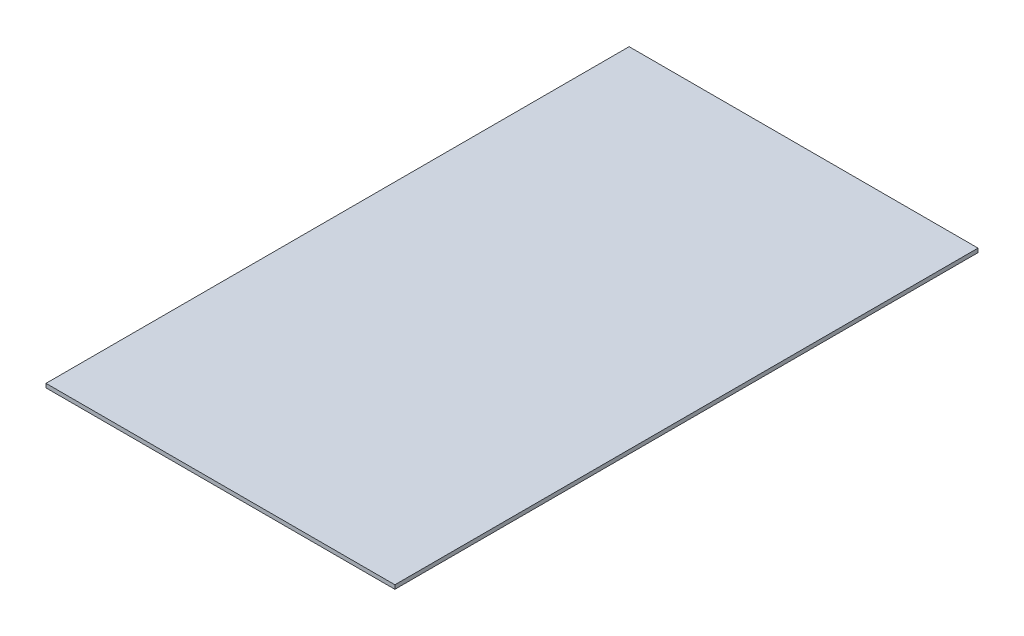
ISO-10303-21;
HEADER;
FILE_DESCRIPTION(('STEP AP214'),'2;1');
FILE_NAME('part.step','',(''),(''),'','','');
FILE_SCHEMA(('AUTOMOTIVE_DESIGN { 1 0 10303 214 1 1 1 1 }'));
ENDSEC;
DATA;
#1=APPLICATION_CONTEXT('core data for automotive mechanical design processes');
#2=APPLICATION_PROTOCOL_DEFINITION('international standard','automotive_design',2000,#1);
#3=PRODUCT_CONTEXT('',#1,'mechanical');
#4=PRODUCT('Part','Part','',(#3));
#5=PRODUCT_RELATED_PRODUCT_CATEGORY('part','',(#4));
#6=PRODUCT_DEFINITION_FORMATION('','',#4);
#7=PRODUCT_DEFINITION_CONTEXT('part definition',#1,'design');
#8=PRODUCT_DEFINITION('design','',#6,#7);
#9=PRODUCT_DEFINITION_SHAPE('','',#8);
#10=(LENGTH_UNIT() NAMED_UNIT(*) SI_UNIT(.MILLI.,.METRE.));
#11=(NAMED_UNIT(*) PLANE_ANGLE_UNIT() SI_UNIT($,.RADIAN.));
#12=(NAMED_UNIT(*) SI_UNIT($,.STERADIAN.) SOLID_ANGLE_UNIT());
#13=UNCERTAINTY_MEASURE_WITH_UNIT(LENGTH_MEASURE(1.E-05),#10,'distance_accuracy_value','');
#14=(GEOMETRIC_REPRESENTATION_CONTEXT(3) GLOBAL_UNCERTAINTY_ASSIGNED_CONTEXT((#13)) GLOBAL_UNIT_ASSIGNED_CONTEXT((#10,
#11,#12)) REPRESENTATION_CONTEXT('',''));
#15=CARTESIAN_POINT('',(0.,0.,0.));
#16=DIRECTION('',(0.,0.,1.));
#17=DIRECTION('',(1.,0.,0.));
#18=AXIS2_PLACEMENT_3D('',#15,#16,#17);
#19=CARTESIAN_POINT('',(0.,0.,0.));
#20=DIRECTION('',(0.,1.,0.));
#21=DIRECTION('',(1.,0.,0.));
#22=AXIS2_PLACEMENT_3D('',#19,#20,#21);
#23=PLANE('',#22);
#24=DIRECTION('',(-1.,0.,0.));
#25=VECTOR('',#24,1.);
#26=CARTESIAN_POINT('',(35.15,0.,-58.75));
#27=LINE('',#26,#25);
#28=CARTESIAN_POINT('',(35.15,0.,-58.75));
#29=VERTEX_POINT('',#28);
#30=CARTESIAN_POINT('',(-35.15,0.,-58.75));
#31=VERTEX_POINT('',#30);
#32=EDGE_CURVE('E20',#29,#31,#27,.T.);
#33=ORIENTED_EDGE('',*,*,#32,.F.);
#34=DIRECTION('',(0.,0.,-1.));
#35=VECTOR('',#34,1.);
#36=CARTESIAN_POINT('',(35.15,0.,58.75));
#37=LINE('',#36,#35);
#38=CARTESIAN_POINT('',(35.15,0.,58.75));
#39=VERTEX_POINT('',#38);
#40=EDGE_CURVE('E87',#39,#29,#37,.T.);
#41=ORIENTED_EDGE('',*,*,#40,.F.);
#42=DIRECTION('',(1.,0.,0.));
#43=VECTOR('',#42,1.);
#44=CARTESIAN_POINT('',(-35.15,0.,58.75));
#45=LINE('',#44,#43);
#46=CARTESIAN_POINT('',(-35.15,0.,58.75));
#47=VERTEX_POINT('',#46);
#48=EDGE_CURVE('E81',#47,#39,#45,.T.);
#49=ORIENTED_EDGE('',*,*,#48,.F.);
#50=DIRECTION('',(0.,0.,1.));
#51=VECTOR('',#50,1.);
#52=CARTESIAN_POINT('',(-35.15,0.,-58.75));
#53=LINE('',#52,#51);
#54=EDGE_CURVE('E66',#31,#47,#53,.T.);
#55=ORIENTED_EDGE('',*,*,#54,.F.);
#56=EDGE_LOOP('',(#33,#41,#49,#55));
#57=FACE_BOUND('',#56,.T.);
#58=ADVANCED_FACE('F17',(#57),#23,.F.);
#59=CARTESIAN_POINT('',(0.,0.8,0.));
#60=DIRECTION('',(0.,1.,0.));
#61=DIRECTION('',(1.,0.,0.));
#62=AXIS2_PLACEMENT_3D('',#59,#60,#61);
#63=PLANE('',#62);
#64=DIRECTION('',(-1.,0.,0.));
#65=VECTOR('',#64,1.);
#66=CARTESIAN_POINT('',(35.15,0.8,-58.75));
#67=LINE('',#66,#65);
#68=CARTESIAN_POINT('',(35.15,0.8,-58.75));
#69=VERTEX_POINT('',#68);
#70=CARTESIAN_POINT('',(-35.15,0.8,-58.75));
#71=VERTEX_POINT('',#70);
#72=EDGE_CURVE('E11',#69,#71,#67,.T.);
#73=ORIENTED_EDGE('',*,*,#72,.T.);
#74=DIRECTION('',(0.,0.,1.));
#75=VECTOR('',#74,1.);
#76=CARTESIAN_POINT('',(-35.15,0.8,-58.75));
#77=LINE('',#76,#75);
#78=CARTESIAN_POINT('',(-35.15,0.8,58.75));
#79=VERTEX_POINT('',#78);
#80=EDGE_CURVE('E76',#71,#79,#77,.T.);
#81=ORIENTED_EDGE('',*,*,#80,.T.);
#82=DIRECTION('',(1.,0.,0.));
#83=VECTOR('',#82,1.);
#84=CARTESIAN_POINT('',(-35.15,0.8,58.75));
#85=LINE('',#84,#83);
#86=CARTESIAN_POINT('',(35.15,0.8,58.75));
#87=VERTEX_POINT('',#86);
#88=EDGE_CURVE('E83',#79,#87,#85,.T.);
#89=ORIENTED_EDGE('',*,*,#88,.T.);
#90=DIRECTION('',(0.,0.,-1.));
#91=VECTOR('',#90,1.);
#92=CARTESIAN_POINT('',(35.15,0.8,58.75));
#93=LINE('',#92,#91);
#94=EDGE_CURVE('E97',#87,#69,#93,.T.);
#95=ORIENTED_EDGE('',*,*,#94,.T.);
#96=EDGE_LOOP('',(#73,#81,#89,#95));
#97=FACE_BOUND('',#96,.T.);
#98=ADVANCED_FACE('F136',(#97),#63,.T.);
#99=CARTESIAN_POINT('',(35.15,0.,-58.75));
#100=DIRECTION('',(0.,0.,-1.));
#101=DIRECTION('',(0.,-1.,0.));
#102=AXIS2_PLACEMENT_3D('',#99,#100,#101);
#103=PLANE('',#102);
#104=ORIENTED_EDGE('',*,*,#32,.T.);
#105=DIRECTION('',(0.,1.,0.));
#106=VECTOR('',#105,1.);
#107=CARTESIAN_POINT('',(-35.15,0.,-58.75));
#108=LINE('',#107,#106);
#109=EDGE_CURVE('E72',#31,#71,#108,.T.);
#110=ORIENTED_EDGE('',*,*,#109,.T.);
#111=ORIENTED_EDGE('',*,*,#72,.F.);
#112=DIRECTION('',(0.,1.,0.));
#113=VECTOR('',#112,1.);
#114=CARTESIAN_POINT('',(35.15,0.,-58.75));
#115=LINE('',#114,#113);
#116=EDGE_CURVE('E111',#29,#69,#115,.T.);
#117=ORIENTED_EDGE('',*,*,#116,.F.);
#118=EDGE_LOOP('',(#104,#110,#111,#117));
#119=FACE_BOUND('',#118,.T.);
#120=ADVANCED_FACE('F141',(#119),#103,.T.);
#121=CARTESIAN_POINT('',(-35.15,0.,-58.75));
#122=DIRECTION('',(-1.,0.,0.));
#123=DIRECTION('',(0.,1.,0.));
#124=AXIS2_PLACEMENT_3D('',#121,#122,#123);
#125=PLANE('',#124);
#126=ORIENTED_EDGE('',*,*,#54,.T.);
#127=DIRECTION('',(0.,1.,0.));
#128=VECTOR('',#127,1.);
#129=CARTESIAN_POINT('',(-35.15,0.,58.75));
#130=LINE('',#129,#128);
#131=EDGE_CURVE('E70',#47,#79,#130,.T.);
#132=ORIENTED_EDGE('',*,*,#131,.T.);
#133=ORIENTED_EDGE('',*,*,#80,.F.);
#134=ORIENTED_EDGE('',*,*,#109,.F.);
#135=EDGE_LOOP('',(#126,#132,#133,#134));
#136=FACE_BOUND('',#135,.T.);
#137=ADVANCED_FACE('F68',(#136),#125,.T.);
#138=CARTESIAN_POINT('',(-35.15,0.,58.75));
#139=DIRECTION('',(0.,0.,1.));
#140=DIRECTION('',(1.,0.,0.));
#141=AXIS2_PLACEMENT_3D('',#138,#139,#140);
#142=PLANE('',#141);
#143=ORIENTED_EDGE('',*,*,#48,.T.);
#144=DIRECTION('',(0.,1.,0.));
#145=VECTOR('',#144,1.);
#146=CARTESIAN_POINT('',(35.15,0.,58.75));
#147=LINE('',#146,#145);
#148=EDGE_CURVE('E89',#39,#87,#147,.T.);
#149=ORIENTED_EDGE('',*,*,#148,.T.);
#150=ORIENTED_EDGE('',*,*,#88,.F.);
#151=ORIENTED_EDGE('',*,*,#131,.F.);
#152=EDGE_LOOP('',(#143,#149,#150,#151));
#153=FACE_BOUND('',#152,.T.);
#154=ADVANCED_FACE('F79',(#153),#142,.T.);
#155=CARTESIAN_POINT('',(35.15,0.,58.75));
#156=DIRECTION('',(1.,0.,0.));
#157=DIRECTION('',(0.,0.,-1.));
#158=AXIS2_PLACEMENT_3D('',#155,#156,#157);
#159=PLANE('',#158);
#160=ORIENTED_EDGE('',*,*,#40,.T.);
#161=ORIENTED_EDGE('',*,*,#116,.T.);
#162=ORIENTED_EDGE('',*,*,#94,.F.);
#163=ORIENTED_EDGE('',*,*,#148,.F.);
#164=EDGE_LOOP('',(#160,#161,#162,#163));
#165=FACE_BOUND('',#164,.T.);
#166=ADVANCED_FACE('F126',(#165),#159,.T.);
#167=CLOSED_SHELL('',(#58,#98,#120,#137,#154,#166));
#168=MANIFOLD_SOLID_BREP('B1',#167);
#169=ADVANCED_BREP_SHAPE_REPRESENTATION('',(#18,#168),#14);
#170=SHAPE_DEFINITION_REPRESENTATION(#9,#169);
ENDSEC;
END-ISO-10303-21;
